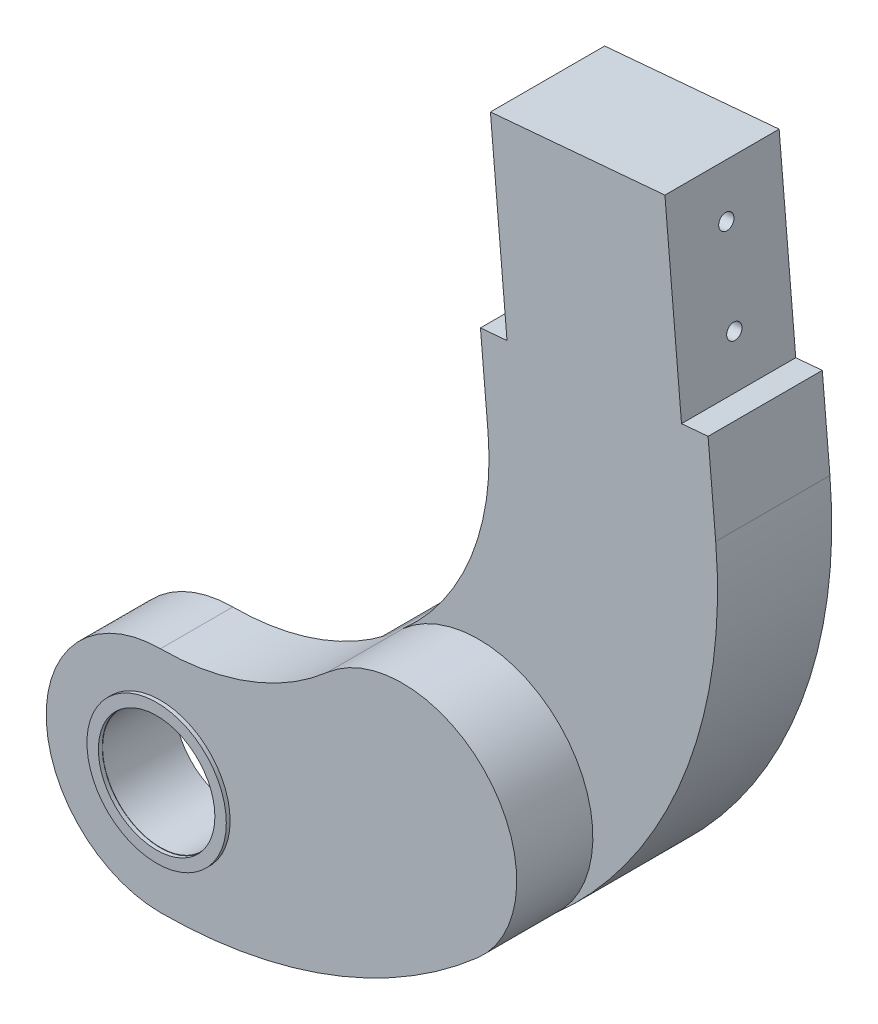
ISO-10303-21;
HEADER;
FILE_DESCRIPTION(('STEP AP214'),'2;1');
FILE_NAME('part.step','',(''),(''),'','','');
FILE_SCHEMA(('AUTOMOTIVE_DESIGN { 1 0 10303 214 1 1 1 1 }'));
ENDSEC;
DATA;
#1=APPLICATION_CONTEXT('core data for automotive mechanical design processes');
#2=APPLICATION_PROTOCOL_DEFINITION('international standard','automotive_design',2000,#1);
#3=PRODUCT_CONTEXT('',#1,'mechanical');
#4=PRODUCT('Part','Part','',(#3));
#5=PRODUCT_RELATED_PRODUCT_CATEGORY('part','',(#4));
#6=PRODUCT_DEFINITION_FORMATION('','',#4);
#7=PRODUCT_DEFINITION_CONTEXT('part definition',#1,'design');
#8=PRODUCT_DEFINITION('design','',#6,#7);
#9=PRODUCT_DEFINITION_SHAPE('','',#8);
#10=(LENGTH_UNIT() NAMED_UNIT(*) SI_UNIT(.MILLI.,.METRE.));
#11=(NAMED_UNIT(*) PLANE_ANGLE_UNIT() SI_UNIT($,.RADIAN.));
#12=(NAMED_UNIT(*) SI_UNIT($,.STERADIAN.) SOLID_ANGLE_UNIT());
#13=UNCERTAINTY_MEASURE_WITH_UNIT(LENGTH_MEASURE(1.E-05),#10,'distance_accuracy_value','');
#14=(GEOMETRIC_REPRESENTATION_CONTEXT(3) GLOBAL_UNCERTAINTY_ASSIGNED_CONTEXT((#13)) GLOBAL_UNIT_ASSIGNED_CONTEXT((#10,
#11,#12)) REPRESENTATION_CONTEXT('',''));
#15=CARTESIAN_POINT('',(0.,0.,0.));
#16=DIRECTION('',(0.,0.,1.));
#17=DIRECTION('',(1.,0.,0.));
#18=AXIS2_PLACEMENT_3D('',#15,#16,#17);
#19=CARTESIAN_POINT('',(0.,0.,25.));
#20=DIRECTION('',(0.,0.,1.));
#21=DIRECTION('',(1.,0.,0.));
#22=AXIS2_PLACEMENT_3D('',#19,#20,#21);
#23=PLANE('',#22);
#24=CARTESIAN_POINT('',(0.,-48.15,25.));
#25=DIRECTION('',(0.,0.,1.));
#26=DIRECTION('',(1.,0.,0.));
#27=AXIS2_PLACEMENT_3D('',#24,#25,#26);
#28=CIRCLE('',#27,7.6);
#29=CARTESIAN_POINT('',(7.6,-48.15,25.));
#30=VERTEX_POINT('',#29);
#31=EDGE_CURVE('E338',#30,#30,#28,.F.);
#32=ORIENTED_EDGE('',*,*,#31,.T.);
#33=EDGE_LOOP('',(#32));
#34=FACE_BOUND('',#33,.T.);
#35=CARTESIAN_POINT('',(0.,-48.15,25.));
#36=DIRECTION('',(0.,0.,1.));
#37=DIRECTION('',(1.,0.,0.));
#38=AXIS2_PLACEMENT_3D('',#35,#36,#37);
#39=CIRCLE('',#38,7.65);
#40=CARTESIAN_POINT('',(7.65,-48.15,25.));
#41=VERTEX_POINT('',#40);
#42=EDGE_CURVE('E11',#41,#41,#39,.F.);
#43=ORIENTED_EDGE('',*,*,#42,.F.);
#44=EDGE_LOOP('',(#43));
#45=FACE_BOUND('',#44,.T.);
#46=ADVANCED_FACE('F38',(#34,#45),#23,.T.);
#47=CARTESIAN_POINT('',(0.,0.,0.));
#48=DIRECTION('',(0.,0.,1.));
#49=DIRECTION('',(1.,0.,0.));
#50=AXIS2_PLACEMENT_3D('',#47,#48,#49);
#51=PLANE('',#50);
#52=CARTESIAN_POINT('',(29.3498711634634,-38.1707684319834,0.));
#53=DIRECTION('',(0.,0.,-1.));
#54=DIRECTION('',(-1.,0.,0.));
#55=AXIS2_PLACEMENT_3D('',#52,#53,#54);
#56=CIRCLE('',#55,15.);
#57=CARTESIAN_POINT('',(38.493133208156,-50.0619735509813,0.));
#58=VERTEX_POINT('',#57);
#59=CARTESIAN_POINT('',(20.2066091187707,-26.2795633129854,0.));
#60=VERTEX_POINT('',#59);
#61=EDGE_CURVE('E277',#58,#60,#56,.T.);
#62=ORIENTED_EDGE('',*,*,#61,.T.);
#63=CARTESIAN_POINT('',(0.,0.,0.));
#64=DIRECTION('',(0.,0.,-1.));
#65=DIRECTION('',(1.,0.,0.));
#66=AXIS2_PLACEMENT_3D('',#63,#64,#65);
#67=CIRCLE('',#66,33.15);
#68=CARTESIAN_POINT('',(33.0238542417414,2.88921287208477,0.));
#69=VERTEX_POINT('',#68);
#70=EDGE_CURVE('E174',#69,#60,#67,.T.);
#71=ORIENTED_EDGE('',*,*,#70,.F.);
#72=DIRECTION('',(0.087155742747656,-0.996194698091746,0.));
#73=VECTOR('',#72,1.);
#74=CARTESIAN_POINT('',(33.0238542417414,2.88921287208477,0.));
#75=LINE('',#74,#73);
#76=CARTESIAN_POINT('',(32.0215632001433,14.3454519001399,0.));
#77=VERTEX_POINT('',#76);
#78=EDGE_CURVE('E194',#77,#69,#75,.T.);
#79=ORIENTED_EDGE('',*,*,#78,.F.);
#80=DIRECTION('',(-0.996194698091746,-0.0871557427476552,0.));
#81=VECTOR('',#80,1.);
#82=CARTESIAN_POINT('',(32.0215632001433,14.3454519001399,0.));
#83=LINE('',#82,#81);
#84=CARTESIAN_POINT('',(35.5082446434644,14.6504969997567,0.));
#85=VERTEX_POINT('',#84);
#86=EDGE_CURVE('E225',#85,#77,#83,.T.);
#87=ORIENTED_EDGE('',*,*,#86,.F.);
#88=DIRECTION('',(0.087155742747657,-0.996194698091746,0.));
#89=VECTOR('',#88,1.);
#90=CARTESIAN_POINT('',(35.5082446434644,14.6504969997567,0.));
#91=LINE('',#90,#89);
#92=CARTESIAN_POINT('',(33.329351074773,39.5553644520503,0.));
#93=VERTEX_POINT('',#92);
#94=EDGE_CURVE('E223',#93,#85,#91,.T.);
#95=ORIENTED_EDGE('',*,*,#94,.F.);
#96=DIRECTION('',(-0.996194698091746,-0.0871557427476559,0.));
#97=VECTOR('',#96,1.);
#98=CARTESIAN_POINT('',(33.329351074773,39.5553644520503,0.));
#99=LINE('',#98,#97);
#100=CARTESIAN_POINT('',(56.2418291308832,41.5599465352464,0.));
#101=VERTEX_POINT('',#100);
#102=EDGE_CURVE('E221',#101,#93,#99,.T.);
#103=ORIENTED_EDGE('',*,*,#102,.F.);
#104=DIRECTION('',(-0.0871557427476553,0.996194698091746,0.));
#105=VECTOR('',#104,1.);
#106=CARTESIAN_POINT('',(58.4207226995746,16.6550790829527,0.));
#107=LINE('',#106,#105);
#108=CARTESIAN_POINT('',(58.4207226995746,16.6550790829527,0.));
#109=VERTEX_POINT('',#108);
#110=EDGE_CURVE('E219',#109,#101,#107,.T.);
#111=ORIENTED_EDGE('',*,*,#110,.F.);
#112=DIRECTION('',(-0.996194698091746,-0.0871557427476566,0.));
#113=VECTOR('',#112,1.);
#114=CARTESIAN_POINT('',(61.9074041428957,16.9601241825695,0.));
#115=LINE('',#114,#113);
#116=CARTESIAN_POINT('',(61.9074041428957,16.9601241825695,0.));
#117=VERTEX_POINT('',#116);
#118=EDGE_CURVE('E217',#117,#109,#115,.T.);
#119=ORIENTED_EDGE('',*,*,#118,.F.);
#120=DIRECTION('',(-0.0871557427476578,0.996194698091746,0.));
#121=VECTOR('',#120,1.);
#122=CARTESIAN_POINT('',(61.9074041428957,16.9601241825695,0.));
#123=LINE('',#122,#121);
#124=CARTESIAN_POINT('',(62.9096951844937,5.50388515451443,0.));
#125=VERTEX_POINT('',#124);
#126=EDGE_CURVE('E215',#125,#117,#123,.T.);
#127=ORIENTED_EDGE('',*,*,#126,.F.);
#128=CARTESIAN_POINT('',(0.,0.,0.));
#129=DIRECTION('',(0.,0.,1.));
#130=DIRECTION('',(1.,0.,0.));
#131=AXIS2_PLACEMENT_3D('',#128,#129,#130);
#132=CIRCLE('',#131,63.15);
#133=EDGE_CURVE('E213',#58,#125,#132,.T.);
#134=ORIENTED_EDGE('',*,*,#133,.F.);
#135=EDGE_LOOP('',(#62,#71,#79,#87,#95,#103,#111,#119,#127,#134));
#136=FACE_BOUND('',#135,.T.);
#137=ADVANCED_FACE('F257',(#136),#51,.F.);
#138=CARTESIAN_POINT('',(0.,0.,15.));
#139=DIRECTION('',(0.,0.,-1.));
#140=DIRECTION('',(-1.,0.,0.));
#141=AXIS2_PLACEMENT_3D('',#138,#139,#140);
#142=CYLINDRICAL_SURFACE('',#141,33.15);
#143=DIRECTION('',(0.,0.,-1.));
#144=VECTOR('',#143,1.);
#145=CARTESIAN_POINT('',(20.2066091187707,-26.2795633129854,15.5));
#146=LINE('',#145,#144);
#147=CARTESIAN_POINT('',(20.2066091187707,-26.2795633129854,15.5));
#148=VERTEX_POINT('',#147);
#149=EDGE_CURVE('E284',#148,#60,#146,.T.);
#150=ORIENTED_EDGE('',*,*,#149,.F.);
#151=CARTESIAN_POINT('',(0.,0.,15.5));
#152=DIRECTION('',(0.,0.,-1.));
#153=DIRECTION('',(-1.,0.,0.));
#154=AXIS2_PLACEMENT_3D('',#151,#152,#153);
#155=CIRCLE('',#154,33.15);
#156=CARTESIAN_POINT('',(0.,-33.15,15.5));
#157=VERTEX_POINT('',#156);
#158=EDGE_CURVE('E153',#157,#148,#155,.F.);
#159=ORIENTED_EDGE('',*,*,#158,.F.);
#160=DIRECTION('',(0.,0.,-1.));
#161=VECTOR('',#160,1.);
#162=CARTESIAN_POINT('',(0.,-33.15,15.));
#163=LINE('',#162,#161);
#164=CARTESIAN_POINT('',(0.,-33.15,25.));
#165=VERTEX_POINT('',#164);
#166=EDGE_CURVE('E46',#165,#157,#163,.T.);
#167=ORIENTED_EDGE('',*,*,#166,.F.);
#168=CARTESIAN_POINT('',(0.,0.,25.));
#169=DIRECTION('',(0.,0.,1.));
#170=DIRECTION('',(1.,0.,0.));
#171=AXIS2_PLACEMENT_3D('',#168,#169,#170);
#172=CIRCLE('',#171,33.15);
#173=CARTESIAN_POINT('',(21.8830160016186,-24.9009258999119,25.));
#174=VERTEX_POINT('',#173);
#175=EDGE_CURVE('E337',#174,#165,#172,.F.);
#176=ORIENTED_EDGE('',*,*,#175,.F.);
#177=DIRECTION('',(0.,0.,-1.));
#178=VECTOR('',#177,1.);
#179=CARTESIAN_POINT('',(21.8830160016186,-24.9009258999119,25.));
#180=LINE('',#179,#178);
#181=CARTESIAN_POINT('',(21.8830160016186,-24.9009258999119,15.));
#182=VERTEX_POINT('',#181);
#183=EDGE_CURVE('E347',#174,#182,#180,.T.);
#184=ORIENTED_EDGE('',*,*,#183,.T.);
#185=CARTESIAN_POINT('',(0.,0.,15.));
#186=DIRECTION('',(0.,0.,-1.));
#187=DIRECTION('',(1.,0.,0.));
#188=AXIS2_PLACEMENT_3D('',#185,#186,#187);
#189=CIRCLE('',#188,33.15);
#190=CARTESIAN_POINT('',(33.0238542417414,2.88921287208477,15.));
#191=VERTEX_POINT('',#190);
#192=EDGE_CURVE('E191',#191,#182,#189,.T.);
#193=ORIENTED_EDGE('',*,*,#192,.F.);
#194=DIRECTION('',(0.,0.,-1.));
#195=VECTOR('',#194,1.);
#196=CARTESIAN_POINT('',(33.0238542417414,2.88921287208477,15.));
#197=LINE('',#196,#195);
#198=EDGE_CURVE('E210',#191,#69,#197,.T.);
#199=ORIENTED_EDGE('',*,*,#198,.T.);
#200=ORIENTED_EDGE('',*,*,#70,.T.);
#201=EDGE_LOOP('',(#150,#159,#167,#176,#184,#193,#199,#200));
#202=FACE_BOUND('',#201,.T.);
#203=ADVANCED_FACE('F40',(#202),#142,.F.);
#204=CARTESIAN_POINT('',(0.,-48.15,15.));
#205=DIRECTION('',(0.,0.,-1.));
#206=DIRECTION('',(-1.,0.,0.));
#207=AXIS2_PLACEMENT_3D('',#204,#205,#206);
#208=CYLINDRICAL_SURFACE('',#207,15.);
#209=CARTESIAN_POINT('',(0.,-48.15,15.5));
#210=DIRECTION('',(0.,0.,-1.));
#211=DIRECTION('',(-1.,0.,0.));
#212=AXIS2_PLACEMENT_3D('',#209,#210,#211);
#213=CIRCLE('',#212,15.);
#214=CARTESIAN_POINT('',(0.,-63.15,15.5));
#215=VERTEX_POINT('',#214);
#216=EDGE_CURVE('E141',#215,#157,#213,.T.);
#217=ORIENTED_EDGE('',*,*,#216,.F.);
#218=DIRECTION('',(0.,0.,-1.));
#219=VECTOR('',#218,1.);
#220=CARTESIAN_POINT('',(0.,-63.15,15.));
#221=LINE('',#220,#219);
#222=CARTESIAN_POINT('',(0.,-63.15,25.));
#223=VERTEX_POINT('',#222);
#224=EDGE_CURVE('E151',#223,#215,#221,.T.);
#225=ORIENTED_EDGE('',*,*,#224,.F.);
#226=CARTESIAN_POINT('',(0.,-48.15,25.));
#227=DIRECTION('',(0.,0.,1.));
#228=DIRECTION('',(1.,0.,0.));
#229=AXIS2_PLACEMENT_3D('',#226,#227,#228);
#230=CIRCLE('',#229,15.);
#231=EDGE_CURVE('E335',#165,#223,#230,.T.);
#232=ORIENTED_EDGE('',*,*,#231,.F.);
#233=ORIENTED_EDGE('',*,*,#166,.T.);
#234=EDGE_LOOP('',(#217,#225,#232,#233));
#235=FACE_BOUND('',#234,.T.);
#236=ADVANCED_FACE('F149',(#235),#208,.T.);
#237=CARTESIAN_POINT('',(0.,-48.15,15.));
#238=DIRECTION('',(0.,0.,-1.));
#239=DIRECTION('',(-1.,0.,0.));
#240=AXIS2_PLACEMENT_3D('',#237,#238,#239);
#241=CYLINDRICAL_SURFACE('',#240,7.6);
#242=ORIENTED_EDGE('',*,*,#31,.F.);
#243=EDGE_LOOP('',(#242));
#244=FACE_BOUND('',#243,.T.);
#245=CARTESIAN_POINT('',(0.,-48.15,15.5));
#246=DIRECTION('',(0.,0.,-1.));
#247=DIRECTION('',(-1.,0.,0.));
#248=AXIS2_PLACEMENT_3D('',#245,#246,#247);
#249=CIRCLE('',#248,7.6);
#250=CARTESIAN_POINT('',(-7.6,-48.15,15.5));
#251=VERTEX_POINT('',#250);
#252=EDGE_CURVE('E571',#251,#251,#249,.F.);
#253=ORIENTED_EDGE('',*,*,#252,.F.);
#254=EDGE_LOOP('',(#253));
#255=FACE_BOUND('',#254,.T.);
#256=ADVANCED_FACE('F388',(#244,#255),#241,.F.);
#257=CARTESIAN_POINT('',(0.,0.,15.));
#258=DIRECTION('',(0.,0.,1.));
#259=DIRECTION('',(1.,0.,0.));
#260=AXIS2_PLACEMENT_3D('',#257,#258,#259);
#261=PLANE('',#260);
#262=CARTESIAN_POINT('',(31.7848331969212,-36.1683131849399,15.));
#263=DIRECTION('',(0.,0.,1.));
#264=DIRECTION('',(1.,0.,0.));
#265=AXIS2_PLACEMENT_3D('',#262,#263,#264);
#266=CIRCLE('',#265,15.);
#267=CARTESIAN_POINT('',(41.6866503922238,-47.4357004699679,15.));
#268=VERTEX_POINT('',#267);
#269=EDGE_CURVE('E61',#268,#182,#266,.T.);
#270=ORIENTED_EDGE('',*,*,#269,.F.);
#271=CARTESIAN_POINT('',(0.,0.,15.));
#272=DIRECTION('',(0.,0.,1.));
#273=DIRECTION('',(1.,0.,0.));
#274=AXIS2_PLACEMENT_3D('',#271,#272,#273);
#275=CIRCLE('',#274,63.15);
#276=CARTESIAN_POINT('',(62.9096951844937,5.50388515451443,15.));
#277=VERTEX_POINT('',#276);
#278=EDGE_CURVE('E193',#268,#277,#275,.T.);
#279=ORIENTED_EDGE('',*,*,#278,.T.);
#280=DIRECTION('',(-0.0871557427476578,0.996194698091746,0.));
#281=VECTOR('',#280,1.);
#282=CARTESIAN_POINT('',(61.9074041428957,16.9601241825695,15.));
#283=LINE('',#282,#281);
#284=CARTESIAN_POINT('',(61.9074041428957,16.9601241825695,15.));
#285=VERTEX_POINT('',#284);
#286=EDGE_CURVE('E196',#277,#285,#283,.T.);
#287=ORIENTED_EDGE('',*,*,#286,.T.);
#288=DIRECTION('',(-0.996194698091746,-0.0871557427476566,0.));
#289=VECTOR('',#288,1.);
#290=CARTESIAN_POINT('',(61.9074041428957,16.9601241825695,15.));
#291=LINE('',#290,#289);
#292=CARTESIAN_POINT('',(58.4207226995746,16.6550790829527,15.));
#293=VERTEX_POINT('',#292);
#294=EDGE_CURVE('E198',#285,#293,#291,.T.);
#295=ORIENTED_EDGE('',*,*,#294,.T.);
#296=DIRECTION('',(-0.0871557427476553,0.996194698091746,0.));
#297=VECTOR('',#296,1.);
#298=CARTESIAN_POINT('',(58.4207226995746,16.6550790829527,15.));
#299=LINE('',#298,#297);
#300=CARTESIAN_POINT('',(56.2418291308832,41.5599465352464,15.));
#301=VERTEX_POINT('',#300);
#302=EDGE_CURVE('E200',#293,#301,#299,.T.);
#303=ORIENTED_EDGE('',*,*,#302,.T.);
#304=DIRECTION('',(-0.996194698091746,-0.0871557427476559,0.));
#305=VECTOR('',#304,1.);
#306=CARTESIAN_POINT('',(33.329351074773,39.5553644520503,15.));
#307=LINE('',#306,#305);
#308=CARTESIAN_POINT('',(33.329351074773,39.5553644520503,15.));
#309=VERTEX_POINT('',#308);
#310=EDGE_CURVE('E202',#301,#309,#307,.T.);
#311=ORIENTED_EDGE('',*,*,#310,.T.);
#312=DIRECTION('',(0.087155742747657,-0.996194698091746,0.));
#313=VECTOR('',#312,1.);
#314=CARTESIAN_POINT('',(35.5082446434644,14.6504969997567,15.));
#315=LINE('',#314,#313);
#316=CARTESIAN_POINT('',(35.5082446434644,14.6504969997567,15.));
#317=VERTEX_POINT('',#316);
#318=EDGE_CURVE('E204',#309,#317,#315,.T.);
#319=ORIENTED_EDGE('',*,*,#318,.T.);
#320=DIRECTION('',(-0.996194698091746,-0.0871557427476552,0.));
#321=VECTOR('',#320,1.);
#322=CARTESIAN_POINT('',(32.0215632001433,14.3454519001399,15.));
#323=LINE('',#322,#321);
#324=CARTESIAN_POINT('',(32.0215632001433,14.3454519001399,15.));
#325=VERTEX_POINT('',#324);
#326=EDGE_CURVE('E206',#317,#325,#323,.T.);
#327=ORIENTED_EDGE('',*,*,#326,.T.);
#328=DIRECTION('',(0.087155742747656,-0.996194698091746,0.));
#329=VECTOR('',#328,1.);
#330=CARTESIAN_POINT('',(33.0238542417414,2.88921287208477,15.));
#331=LINE('',#330,#329);
#332=EDGE_CURVE('E208',#325,#191,#331,.T.);
#333=ORIENTED_EDGE('',*,*,#332,.T.);
#334=ORIENTED_EDGE('',*,*,#192,.T.);
#335=EDGE_LOOP('',(#270,#279,#287,#295,#303,#311,#319,#327,#333,#334));
#336=FACE_BOUND('',#335,.T.);
#337=ADVANCED_FACE('F270',(#336),#261,.T.);
#338=CARTESIAN_POINT('',(0.,0.,15.));
#339=DIRECTION('',(0.,0.,-1.));
#340=DIRECTION('',(-1.,0.,0.));
#341=AXIS2_PLACEMENT_3D('',#338,#339,#340);
#342=CYLINDRICAL_SURFACE('',#341,63.15);
#343=CARTESIAN_POINT('',(0.,0.,15.5));
#344=DIRECTION('',(0.,0.,-1.));
#345=DIRECTION('',(-1.,0.,0.));
#346=AXIS2_PLACEMENT_3D('',#343,#344,#345);
#347=CIRCLE('',#346,63.15);
#348=CARTESIAN_POINT('',(38.493133208156,-50.0619735509813,15.5));
#349=VERTEX_POINT('',#348);
#350=EDGE_CURVE('E137',#349,#215,#347,.T.);
#351=ORIENTED_EDGE('',*,*,#350,.F.);
#352=DIRECTION('',(0.,0.,-1.));
#353=VECTOR('',#352,1.);
#354=CARTESIAN_POINT('',(38.493133208156,-50.0619735509813,15.5));
#355=LINE('',#354,#353);
#356=EDGE_CURVE('E275',#349,#58,#355,.T.);
#357=ORIENTED_EDGE('',*,*,#356,.T.);
#358=ORIENTED_EDGE('',*,*,#133,.T.);
#359=DIRECTION('',(0.,0.,-1.));
#360=VECTOR('',#359,1.);
#361=CARTESIAN_POINT('',(62.9096951844937,5.50388515451443,15.));
#362=LINE('',#361,#360);
#363=EDGE_CURVE('E159',#277,#125,#362,.T.);
#364=ORIENTED_EDGE('',*,*,#363,.F.);
#365=ORIENTED_EDGE('',*,*,#278,.F.);
#366=DIRECTION('',(0.,0.,-1.));
#367=VECTOR('',#366,1.);
#368=CARTESIAN_POINT('',(41.6866503922237,-47.4357004699679,25.));
#369=LINE('',#368,#367);
#370=CARTESIAN_POINT('',(41.6866503922237,-47.4357004699679,25.));
#371=VERTEX_POINT('',#370);
#372=EDGE_CURVE('E350',#371,#268,#369,.T.);
#373=ORIENTED_EDGE('',*,*,#372,.F.);
#374=CARTESIAN_POINT('',(0.,0.,25.));
#375=DIRECTION('',(0.,0.,1.));
#376=DIRECTION('',(1.,0.,0.));
#377=AXIS2_PLACEMENT_3D('',#374,#375,#376);
#378=CIRCLE('',#377,63.15);
#379=EDGE_CURVE('E157',#223,#371,#378,.T.);
#380=ORIENTED_EDGE('',*,*,#379,.F.);
#381=ORIENTED_EDGE('',*,*,#224,.T.);
#382=EDGE_LOOP('',(#351,#357,#358,#364,#365,#373,#380,#381));
#383=FACE_BOUND('',#382,.T.);
#384=ADVANCED_FACE('F155',(#383),#342,.T.);
#385=CARTESIAN_POINT('',(61.9074041428957,16.9601241825695,15.));
#386=DIRECTION('',(-0.996194698091746,-0.0871557427476578,0.));
#387=DIRECTION('',(0.0871557427476578,-0.996194698091746,0.));
#388=AXIS2_PLACEMENT_3D('',#385,#386,#387);
#389=PLANE('',#388);
#390=ORIENTED_EDGE('',*,*,#126,.T.);
#391=DIRECTION('',(0.,0.,-1.));
#392=VECTOR('',#391,1.);
#393=CARTESIAN_POINT('',(61.9074041428957,16.9601241825695,15.));
#394=LINE('',#393,#392);
#395=EDGE_CURVE('E163',#285,#117,#394,.T.);
#396=ORIENTED_EDGE('',*,*,#395,.F.);
#397=ORIENTED_EDGE('',*,*,#286,.F.);
#398=ORIENTED_EDGE('',*,*,#363,.T.);
#399=EDGE_LOOP('',(#390,#396,#397,#398));
#400=FACE_BOUND('',#399,.T.);
#401=ADVANCED_FACE('F273',(#400),#389,.F.);
#402=CARTESIAN_POINT('',(61.9074041428957,16.9601241825695,15.));
#403=DIRECTION('',(0.0871557427476566,-0.996194698091746,0.));
#404=DIRECTION('',(0.996194698091746,0.0871557427476566,0.));
#405=AXIS2_PLACEMENT_3D('',#402,#403,#404);
#406=PLANE('',#405);
#407=ORIENTED_EDGE('',*,*,#118,.T.);
#408=DIRECTION('',(0.,0.,-1.));
#409=VECTOR('',#408,1.);
#410=CARTESIAN_POINT('',(58.4207226995746,16.6550790829527,15.));
#411=LINE('',#410,#409);
#412=EDGE_CURVE('E242',#293,#109,#411,.T.);
#413=ORIENTED_EDGE('',*,*,#412,.F.);
#414=ORIENTED_EDGE('',*,*,#294,.F.);
#415=ORIENTED_EDGE('',*,*,#395,.T.);
#416=EDGE_LOOP('',(#407,#413,#414,#415));
#417=FACE_BOUND('',#416,.T.);
#418=ADVANCED_FACE('F249',(#417),#406,.F.);
#419=CARTESIAN_POINT('',(58.4207226995746,16.6550790829527,15.));
#420=DIRECTION('',(-0.996194698091746,-0.0871557427476553,0.));
#421=DIRECTION('',(0.0871557427476553,-0.996194698091746,0.));
#422=AXIS2_PLACEMENT_3D('',#419,#420,#421);
#423=PLANE('',#422);
#424=CARTESIAN_POINT('',(56.8083414587429,35.0846809976502,7.5));
#425=DIRECTION('',(-0.996194698091746,-0.0871557427476553,0.));
#426=DIRECTION('',(0.0871557427476553,-0.996194698091746,0.));
#427=AXIS2_PLACEMENT_3D('',#424,#425,#426);
#428=CIRCLE('',#427,1.);
#429=CARTESIAN_POINT('',(56.8954972014906,34.0884862995584,7.5));
#430=VERTEX_POINT('',#429);
#431=EDGE_CURVE('E170',#430,#430,#428,.T.);
#432=ORIENTED_EDGE('',*,*,#431,.T.);
#433=EDGE_LOOP('',(#432));
#434=FACE_BOUND('',#433,.T.);
#435=CARTESIAN_POINT('',(57.8542103717148,23.1303446205492,7.5));
#436=DIRECTION('',(-0.996194698091746,-0.0871557427476553,0.));
#437=DIRECTION('',(0.0871557427476553,-0.996194698091746,0.));
#438=AXIS2_PLACEMENT_3D('',#435,#436,#437);
#439=CIRCLE('',#438,1.);
#440=CARTESIAN_POINT('',(57.9413661144625,22.1341499224575,7.5));
#441=VERTEX_POINT('',#440);
#442=EDGE_CURVE('E167',#441,#441,#439,.T.);
#443=ORIENTED_EDGE('',*,*,#442,.T.);
#444=EDGE_LOOP('',(#443));
#445=FACE_BOUND('',#444,.T.);
#446=ORIENTED_EDGE('',*,*,#110,.T.);
#447=DIRECTION('',(0.,0.,-1.));
#448=VECTOR('',#447,1.);
#449=CARTESIAN_POINT('',(56.2418291308832,41.5599465352464,15.));
#450=LINE('',#449,#448);
#451=EDGE_CURVE('E239',#301,#101,#450,.T.);
#452=ORIENTED_EDGE('',*,*,#451,.F.);
#453=ORIENTED_EDGE('',*,*,#302,.F.);
#454=ORIENTED_EDGE('',*,*,#412,.T.);
#455=EDGE_LOOP('',(#446,#452,#453,#454));
#456=FACE_BOUND('',#455,.T.);
#457=ADVANCED_FACE('F263',(#434,#445,#456),#423,.F.);
#458=CARTESIAN_POINT('',(33.329351074773,39.5553644520503,15.));
#459=DIRECTION('',(0.0871557427476559,-0.996194698091746,0.));
#460=DIRECTION('',(0.996194698091746,0.0871557427476559,0.));
#461=AXIS2_PLACEMENT_3D('',#458,#459,#460);
#462=PLANE('',#461);
#463=ORIENTED_EDGE('',*,*,#102,.T.);
#464=DIRECTION('',(0.,0.,-1.));
#465=VECTOR('',#464,1.);
#466=CARTESIAN_POINT('',(33.329351074773,39.5553644520503,15.));
#467=LINE('',#466,#465);
#468=EDGE_CURVE('E236',#309,#93,#467,.T.);
#469=ORIENTED_EDGE('',*,*,#468,.F.);
#470=ORIENTED_EDGE('',*,*,#310,.F.);
#471=ORIENTED_EDGE('',*,*,#451,.T.);
#472=EDGE_LOOP('',(#463,#469,#470,#471));
#473=FACE_BOUND('',#472,.T.);
#474=ADVANCED_FACE('F267',(#473),#462,.F.);
#475=CARTESIAN_POINT('',(35.5082446434644,14.6504969997567,15.));
#476=DIRECTION('',(0.996194698091746,0.087155742747657,0.));
#477=DIRECTION('',(-0.087155742747657,0.996194698091746,0.));
#478=AXIS2_PLACEMENT_3D('',#475,#476,#477);
#479=PLANE('',#478);
#480=CARTESIAN_POINT('',(33.8958634026328,33.080098914454,7.5));
#481=DIRECTION('',(0.996194698091746,0.087155742747657,0.));
#482=DIRECTION('',(-0.087155742747657,0.996194698091746,0.));
#483=AXIS2_PLACEMENT_3D('',#480,#481,#482);
#484=CIRCLE('',#483,1.);
#485=CARTESIAN_POINT('',(33.8087076598851,34.0762936125458,7.5));
#486=VERTEX_POINT('',#485);
#487=EDGE_CURVE('E177',#486,#486,#484,.F.);
#488=ORIENTED_EDGE('',*,*,#487,.F.);
#489=EDGE_LOOP('',(#488));
#490=FACE_BOUND('',#489,.T.);
#491=CARTESIAN_POINT('',(34.9417323156047,21.1257625373531,7.5));
#492=DIRECTION('',(0.996194698091746,0.087155742747657,0.));
#493=DIRECTION('',(-0.087155742747657,0.996194698091746,0.));
#494=AXIS2_PLACEMENT_3D('',#491,#492,#493);
#495=CIRCLE('',#494,1.);
#496=CARTESIAN_POINT('',(34.854576572857,22.1219572354448,7.5));
#497=VERTEX_POINT('',#496);
#498=EDGE_CURVE('E175',#497,#497,#495,.F.);
#499=ORIENTED_EDGE('',*,*,#498,.F.);
#500=EDGE_LOOP('',(#499));
#501=FACE_BOUND('',#500,.T.);
#502=ORIENTED_EDGE('',*,*,#94,.T.);
#503=DIRECTION('',(0.,0.,-1.));
#504=VECTOR('',#503,1.);
#505=CARTESIAN_POINT('',(35.5082446434644,14.6504969997567,15.));
#506=LINE('',#505,#504);
#507=EDGE_CURVE('E233',#317,#85,#506,.T.);
#508=ORIENTED_EDGE('',*,*,#507,.F.);
#509=ORIENTED_EDGE('',*,*,#318,.F.);
#510=ORIENTED_EDGE('',*,*,#468,.T.);
#511=EDGE_LOOP('',(#502,#508,#509,#510));
#512=FACE_BOUND('',#511,.T.);
#513=ADVANCED_FACE('F297',(#490,#501,#512),#479,.F.);
#514=CARTESIAN_POINT('',(32.0215632001433,14.3454519001399,15.));
#515=DIRECTION('',(0.0871557427476552,-0.996194698091746,0.));
#516=DIRECTION('',(0.996194698091746,0.0871557427476552,0.));
#517=AXIS2_PLACEMENT_3D('',#514,#515,#516);
#518=PLANE('',#517);
#519=ORIENTED_EDGE('',*,*,#86,.T.);
#520=DIRECTION('',(0.,0.,-1.));
#521=VECTOR('',#520,1.);
#522=CARTESIAN_POINT('',(32.0215632001433,14.3454519001399,15.));
#523=LINE('',#522,#521);
#524=EDGE_CURVE('E230',#325,#77,#523,.T.);
#525=ORIENTED_EDGE('',*,*,#524,.F.);
#526=ORIENTED_EDGE('',*,*,#326,.F.);
#527=ORIENTED_EDGE('',*,*,#507,.T.);
#528=EDGE_LOOP('',(#519,#525,#526,#527));
#529=FACE_BOUND('',#528,.T.);
#530=ADVANCED_FACE('F294',(#529),#518,.F.);
#531=CARTESIAN_POINT('',(33.0238542417414,2.88921287208477,15.));
#532=DIRECTION('',(0.996194698091746,0.087155742747656,0.));
#533=DIRECTION('',(-0.087155742747656,0.996194698091746,0.));
#534=AXIS2_PLACEMENT_3D('',#531,#532,#533);
#535=PLANE('',#534);
#536=ORIENTED_EDGE('',*,*,#78,.T.);
#537=ORIENTED_EDGE('',*,*,#198,.F.);
#538=ORIENTED_EDGE('',*,*,#332,.F.);
#539=ORIENTED_EDGE('',*,*,#524,.T.);
#540=EDGE_LOOP('',(#536,#537,#538,#539));
#541=FACE_BOUND('',#540,.T.);
#542=ADVANCED_FACE('F290',(#541),#535,.F.);
#543=CARTESIAN_POINT('',(51.3789448341185,22.5638322926894,7.5));
#544=DIRECTION('',(0.996194698091746,0.0871557427476554,0.));
#545=DIRECTION('',(-0.0871557427476554,0.996194698091746,0.));
#546=AXIS2_PLACEMENT_3D('',#543,#544,#545);
#547=CYLINDRICAL_SURFACE('',#546,1.);
#548=CARTESIAN_POINT('',(51.3789448341185,22.5638322926894,7.5));
#549=DIRECTION('',(0.996194698091746,0.0871557427476555,0.));
#550=DIRECTION('',(-0.0871557427476555,0.996194698091746,0.));
#551=AXIS2_PLACEMENT_3D('',#548,#549,#550);
#552=CIRCLE('',#551,1.);
#553=CARTESIAN_POINT('',(51.2917890913708,23.5600269907812,7.5));
#554=VERTEX_POINT('',#553);
#555=EDGE_CURVE('E180',#554,#554,#552,.T.);
#556=ORIENTED_EDGE('',*,*,#555,.F.);
#557=EDGE_LOOP('',(#556));
#558=FACE_BOUND('',#557,.T.);
#559=ORIENTED_EDGE('',*,*,#442,.F.);
#560=EDGE_LOOP('',(#559));
#561=FACE_BOUND('',#560,.T.);
#562=ADVANCED_FACE('F384',(#558,#561),#547,.F.);
#563=CARTESIAN_POINT('',(52.9477482035763,4.63232772703789,0.));
#564=DIRECTION('',(0.996194698091746,0.0871557427476555,0.));
#565=DIRECTION('',(-0.0871557427476555,0.996194698091746,0.));
#566=AXIS2_PLACEMENT_3D('',#563,#564,#565);
#567=PLANE('',#566);
#568=ORIENTED_EDGE('',*,*,#555,.T.);
#569=EDGE_LOOP('',(#568));
#570=FACE_BOUND('',#569,.T.);
#571=ADVANCED_FACE('F380',(#570),#567,.T.);
#572=CARTESIAN_POINT('',(50.3330759211466,34.5181686697904,7.5));
#573=DIRECTION('',(0.996194698091746,0.0871557427476554,0.));
#574=DIRECTION('',(-0.0871557427476554,0.996194698091746,0.));
#575=AXIS2_PLACEMENT_3D('',#572,#573,#574);
#576=CYLINDRICAL_SURFACE('',#575,1.);
#577=CARTESIAN_POINT('',(50.3330759211466,34.5181686697904,7.5));
#578=DIRECTION('',(0.996194698091746,0.0871557427476555,0.));
#579=DIRECTION('',(-0.0871557427476555,0.996194698091746,0.));
#580=AXIS2_PLACEMENT_3D('',#577,#578,#579);
#581=CIRCLE('',#580,1.);
#582=CARTESIAN_POINT('',(50.245920178399,35.5143633678821,7.5));
#583=VERTEX_POINT('',#582);
#584=EDGE_CURVE('E171',#583,#583,#581,.T.);
#585=ORIENTED_EDGE('',*,*,#584,.F.);
#586=EDGE_LOOP('',(#585));
#587=FACE_BOUND('',#586,.T.);
#588=ORIENTED_EDGE('',*,*,#431,.F.);
#589=EDGE_LOOP('',(#588));
#590=FACE_BOUND('',#589,.T.);
#591=ADVANCED_FACE('F376',(#587,#590),#576,.F.);
#592=CARTESIAN_POINT('',(52.9477482035763,4.63232772703789,0.));
#593=DIRECTION('',(0.996194698091746,0.0871557427476555,0.));
#594=DIRECTION('',(-0.0871557427476555,0.996194698091746,0.));
#595=AXIS2_PLACEMENT_3D('',#592,#593,#594);
#596=PLANE('',#595);
#597=ORIENTED_EDGE('',*,*,#584,.T.);
#598=EDGE_LOOP('',(#597));
#599=FACE_BOUND('',#598,.T.);
#600=ADVANCED_FACE('F370',(#599),#596,.T.);
#601=CARTESIAN_POINT('',(41.416997853201,21.6922748652129,7.5));
#602=DIRECTION('',(-0.996194698091745,-0.0871557427476602,0.));
#603=DIRECTION('',(0.0871557427476602,-0.996194698091745,0.));
#604=AXIS2_PLACEMENT_3D('',#601,#602,#603);
#605=CYLINDRICAL_SURFACE('',#604,1.);
#606=CARTESIAN_POINT('',(41.416997853201,21.6922748652129,7.5));
#607=DIRECTION('',(0.996194698091746,0.0871557427476602,0.));
#608=DIRECTION('',(-0.0871557427476601,0.996194698091745,0.));
#609=AXIS2_PLACEMENT_3D('',#606,#607,#608);
#610=CIRCLE('',#609,1.);
#611=CARTESIAN_POINT('',(41.3298421104534,22.6884695633046,7.5));
#612=VERTEX_POINT('',#611);
#613=EDGE_CURVE('E352',#612,#612,#610,.T.);
#614=ORIENTED_EDGE('',*,*,#613,.T.);
#615=EDGE_LOOP('',(#614));
#616=FACE_BOUND('',#615,.T.);
#617=ORIENTED_EDGE('',*,*,#498,.T.);
#618=EDGE_LOOP('',(#617));
#619=FACE_BOUND('',#618,.T.);
#620=ADVANCED_FACE('F357',(#616,#619),#605,.F.);
#621=CARTESIAN_POINT('',(42.9858012226589,3.76077029956132,0.));
#622=DIRECTION('',(-0.996194698091746,-0.0871557427476602,0.));
#623=DIRECTION('',(-0.0871557427476601,0.996194698091745,0.));
#624=AXIS2_PLACEMENT_3D('',#621,#622,#623);
#625=PLANE('',#624);
#626=ORIENTED_EDGE('',*,*,#613,.F.);
#627=EDGE_LOOP('',(#626));
#628=FACE_BOUND('',#627,.T.);
#629=ADVANCED_FACE('F360',(#628),#625,.T.);
#630=CARTESIAN_POINT('',(40.3711289402291,33.6466112423138,7.5));
#631=DIRECTION('',(-0.996194698091745,-0.0871557427476602,0.));
#632=DIRECTION('',(0.0871557427476602,-0.996194698091745,0.));
#633=AXIS2_PLACEMENT_3D('',#630,#631,#632);
#634=CYLINDRICAL_SURFACE('',#633,1.);
#635=CARTESIAN_POINT('',(40.3711289402291,33.6466112423138,7.5));
#636=DIRECTION('',(0.996194698091746,0.0871557427476602,0.));
#637=DIRECTION('',(-0.0871557427476601,0.996194698091745,0.));
#638=AXIS2_PLACEMENT_3D('',#635,#636,#637);
#639=CIRCLE('',#638,1.);
#640=CARTESIAN_POINT('',(40.2839731974815,34.6428059404056,7.5));
#641=VERTEX_POINT('',#640);
#642=EDGE_CURVE('E178',#641,#641,#639,.T.);
#643=ORIENTED_EDGE('',*,*,#642,.T.);
#644=EDGE_LOOP('',(#643));
#645=FACE_BOUND('',#644,.T.);
#646=ORIENTED_EDGE('',*,*,#487,.T.);
#647=EDGE_LOOP('',(#646));
#648=FACE_BOUND('',#647,.T.);
#649=ADVANCED_FACE('F362',(#645,#648),#634,.F.);
#650=CARTESIAN_POINT('',(42.9858012226589,3.76077029956132,0.));
#651=DIRECTION('',(-0.996194698091746,-0.0871557427476602,0.));
#652=DIRECTION('',(-0.0871557427476601,0.996194698091745,0.));
#653=AXIS2_PLACEMENT_3D('',#650,#651,#652);
#654=PLANE('',#653);
#655=ORIENTED_EDGE('',*,*,#642,.F.);
#656=EDGE_LOOP('',(#655));
#657=FACE_BOUND('',#656,.T.);
#658=ADVANCED_FACE('F328',(#657),#654,.T.);
#659=CARTESIAN_POINT('',(31.7848331969212,-36.1683131849399,25.));
#660=DIRECTION('',(0.,0.,-1.));
#661=DIRECTION('',(-1.,0.,0.));
#662=AXIS2_PLACEMENT_3D('',#659,#660,#661);
#663=CYLINDRICAL_SURFACE('',#662,15.);
#664=ORIENTED_EDGE('',*,*,#269,.T.);
#665=ORIENTED_EDGE('',*,*,#183,.F.);
#666=CARTESIAN_POINT('',(31.7848331969212,-36.1683131849399,25.));
#667=DIRECTION('',(0.,0.,1.));
#668=DIRECTION('',(1.,0.,0.));
#669=AXIS2_PLACEMENT_3D('',#666,#667,#668);
#670=CIRCLE('',#669,15.);
#671=EDGE_CURVE('E340',#371,#174,#670,.T.);
#672=ORIENTED_EDGE('',*,*,#671,.F.);
#673=ORIENTED_EDGE('',*,*,#372,.T.);
#674=EDGE_LOOP('',(#664,#665,#672,#673));
#675=FACE_BOUND('',#674,.T.);
#676=ADVANCED_FACE('F322',(#675),#663,.T.);
#677=CARTESIAN_POINT('',(0.,-48.15,25.));
#678=DIRECTION('',(0.,0.,1.));
#679=DIRECTION('',(1.,0.,0.));
#680=AXIS2_PLACEMENT_3D('',#677,#678,#679);
#681=CIRCLE('',#680,9.15);
#682=CARTESIAN_POINT('',(9.15,-48.15,25.));
#683=VERTEX_POINT('',#682);
#684=EDGE_CURVE('E333',#683,#683,#681,.T.);
#685=ORIENTED_EDGE('',*,*,#684,.F.);
#686=EDGE_LOOP('',(#685));
#687=FACE_BOUND('',#686,.T.);
#688=ORIENTED_EDGE('',*,*,#231,.T.);
#689=ORIENTED_EDGE('',*,*,#379,.T.);
#690=ORIENTED_EDGE('',*,*,#671,.T.);
#691=ORIENTED_EDGE('',*,*,#175,.T.);
#692=EDGE_LOOP('',(#688,#689,#690,#691));
#693=FACE_BOUND('',#692,.T.);
#694=ADVANCED_FACE('F311',(#687,#693),#23,.T.);
#695=CARTESIAN_POINT('',(29.3498711634634,-38.1707684319834,15.5));
#696=DIRECTION('',(0.,0.,-1.));
#697=DIRECTION('',(-1.,0.,0.));
#698=AXIS2_PLACEMENT_3D('',#695,#696,#697);
#699=CYLINDRICAL_SURFACE('',#698,15.);
#700=ORIENTED_EDGE('',*,*,#61,.F.);
#701=ORIENTED_EDGE('',*,*,#356,.F.);
#702=CARTESIAN_POINT('',(29.3498711634634,-38.1707684319834,15.5));
#703=DIRECTION('',(0.,0.,-1.));
#704=DIRECTION('',(-1.,0.,0.));
#705=AXIS2_PLACEMENT_3D('',#702,#703,#704);
#706=CIRCLE('',#705,15.);
#707=EDGE_CURVE('E53',#349,#148,#706,.T.);
#708=ORIENTED_EDGE('',*,*,#707,.T.);
#709=ORIENTED_EDGE('',*,*,#149,.T.);
#710=EDGE_LOOP('',(#700,#701,#708,#709));
#711=FACE_BOUND('',#710,.T.);
#712=ADVANCED_FACE('F321',(#711),#699,.T.);
#713=CARTESIAN_POINT('',(0.,0.,15.5));
#714=DIRECTION('',(0.,0.,-1.));
#715=DIRECTION('',(-1.,0.,0.));
#716=AXIS2_PLACEMENT_3D('',#713,#714,#715);
#717=PLANE('',#716);
#718=ORIENTED_EDGE('',*,*,#707,.F.);
#719=ORIENTED_EDGE('',*,*,#350,.T.);
#720=ORIENTED_EDGE('',*,*,#216,.T.);
#721=ORIENTED_EDGE('',*,*,#158,.T.);
#722=EDGE_LOOP('',(#718,#719,#720,#721));
#723=FACE_BOUND('',#722,.T.);
#724=ORIENTED_EDGE('',*,*,#252,.T.);
#725=EDGE_LOOP('',(#724));
#726=FACE_BOUND('',#725,.T.);
#727=ADVANCED_FACE('F139',(#723,#726),#717,.T.);
#728=CARTESIAN_POINT('',(0.,-48.15,25.5));
#729=DIRECTION('',(0.,0.,1.));
#730=DIRECTION('',(1.,0.,0.));
#731=AXIS2_PLACEMENT_3D('',#728,#729,#730);
#732=PLANE('',#731);
#733=CARTESIAN_POINT('',(0.,-48.15,25.5));
#734=DIRECTION('',(0.,0.,1.));
#735=DIRECTION('',(1.,0.,0.));
#736=AXIS2_PLACEMENT_3D('',#733,#734,#735);
#737=CIRCLE('',#736,9.15);
#738=CARTESIAN_POINT('',(9.15,-48.15,25.5));
#739=VERTEX_POINT('',#738);
#740=EDGE_CURVE('E280',#739,#739,#737,.T.);
#741=ORIENTED_EDGE('',*,*,#740,.T.);
#742=EDGE_LOOP('',(#741));
#743=FACE_BOUND('',#742,.T.);
#744=CARTESIAN_POINT('',(0.,-48.15,25.5));
#745=DIRECTION('',(0.,0.,1.));
#746=DIRECTION('',(1.,0.,0.));
#747=AXIS2_PLACEMENT_3D('',#744,#745,#746);
#748=CIRCLE('',#747,7.65);
#749=CARTESIAN_POINT('',(7.65,-48.15,25.5));
#750=VERTEX_POINT('',#749);
#751=EDGE_CURVE('E561',#750,#750,#748,.T.);
#752=ORIENTED_EDGE('',*,*,#751,.F.);
#753=EDGE_LOOP('',(#752));
#754=FACE_BOUND('',#753,.T.);
#755=ADVANCED_FACE('F512',(#743,#754),#732,.T.);
#756=CARTESIAN_POINT('',(0.,-48.15,25.5));
#757=DIRECTION('',(0.,0.,-1.));
#758=DIRECTION('',(-1.,0.,0.));
#759=AXIS2_PLACEMENT_3D('',#756,#757,#758);
#760=CYLINDRICAL_SURFACE('',#759,9.15);
#761=ORIENTED_EDGE('',*,*,#740,.F.);
#762=EDGE_LOOP('',(#761));
#763=FACE_BOUND('',#762,.T.);
#764=ORIENTED_EDGE('',*,*,#684,.T.);
#765=EDGE_LOOP('',(#764));
#766=FACE_BOUND('',#765,.T.);
#767=ADVANCED_FACE('F534',(#763,#766),#760,.T.);
#768=CARTESIAN_POINT('',(0.,-48.15,25.5));
#769=DIRECTION('',(0.,0.,-1.));
#770=DIRECTION('',(-1.,0.,0.));
#771=AXIS2_PLACEMENT_3D('',#768,#769,#770);
#772=CYLINDRICAL_SURFACE('',#771,7.65);
#773=ORIENTED_EDGE('',*,*,#751,.T.);
#774=EDGE_LOOP('',(#773));
#775=FACE_BOUND('',#774,.T.);
#776=ORIENTED_EDGE('',*,*,#42,.T.);
#777=EDGE_LOOP('',(#776));
#778=FACE_BOUND('',#777,.T.);
#779=ADVANCED_FACE('F544',(#775,#778),#772,.F.);
#780=CLOSED_SHELL('',(#46,#137,#203,#236,#256,#337,#384,#401,#418,#457,#474,#513,#530,#542,#562,
#571,#591,#600,#620,#629,#649,#658,#676,#694,#712,#727,#755,#767,#779));
#781=MANIFOLD_SOLID_BREP('B2',#780);
#782=ADVANCED_BREP_SHAPE_REPRESENTATION('',(#18,#781),#14);
#783=SHAPE_DEFINITION_REPRESENTATION(#9,#782);
ENDSEC;
END-ISO-10303-21;
